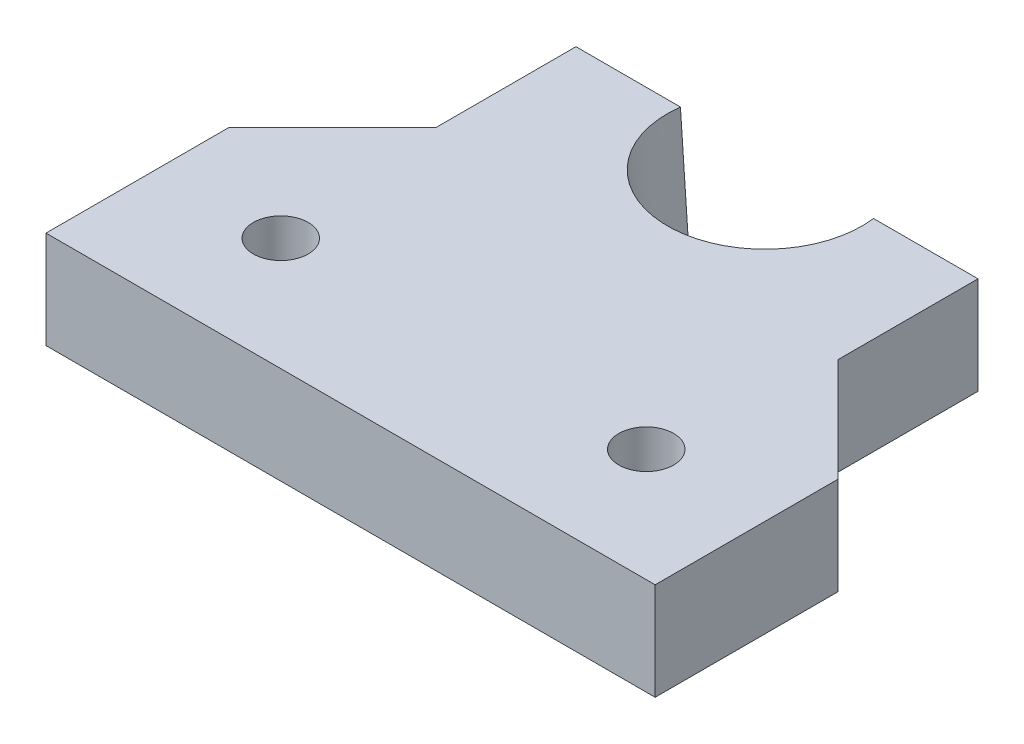
ISO-10303-21;
HEADER;
FILE_DESCRIPTION(('STEP AP214'),'2;1');
FILE_NAME('part.step','',(''),(''),'','','');
FILE_SCHEMA(('AUTOMOTIVE_DESIGN { 1 0 10303 214 1 1 1 1 }'));
ENDSEC;
DATA;
#1=APPLICATION_CONTEXT('core data for automotive mechanical design processes');
#2=APPLICATION_PROTOCOL_DEFINITION('international standard','automotive_design',2000,#1);
#3=PRODUCT_CONTEXT('',#1,'mechanical');
#4=PRODUCT('Part','Part','',(#3));
#5=PRODUCT_RELATED_PRODUCT_CATEGORY('part','',(#4));
#6=PRODUCT_DEFINITION_FORMATION('','',#4);
#7=PRODUCT_DEFINITION_CONTEXT('part definition',#1,'design');
#8=PRODUCT_DEFINITION('design','',#6,#7);
#9=PRODUCT_DEFINITION_SHAPE('','',#8);
#10=(LENGTH_UNIT() NAMED_UNIT(*) SI_UNIT(.MILLI.,.METRE.));
#11=(NAMED_UNIT(*) PLANE_ANGLE_UNIT() SI_UNIT($,.RADIAN.));
#12=(NAMED_UNIT(*) SI_UNIT($,.STERADIAN.) SOLID_ANGLE_UNIT());
#13=UNCERTAINTY_MEASURE_WITH_UNIT(LENGTH_MEASURE(1.E-05),#10,'distance_accuracy_value','');
#14=(GEOMETRIC_REPRESENTATION_CONTEXT(3) GLOBAL_UNCERTAINTY_ASSIGNED_CONTEXT((#13)) GLOBAL_UNIT_ASSIGNED_CONTEXT((#10,
#11,#12)) REPRESENTATION_CONTEXT('',''));
#15=CARTESIAN_POINT('',(0.,0.,0.));
#16=DIRECTION('',(0.,0.,1.));
#17=DIRECTION('',(1.,0.,0.));
#18=AXIS2_PLACEMENT_3D('',#15,#16,#17);
#19=CARTESIAN_POINT('',(-16.5,8.,-23.9262531440162));
#20=DIRECTION('',(0.,0.,-1.));
#21=DIRECTION('',(-1.,0.,0.));
#22=AXIS2_PLACEMENT_3D('',#19,#20,#21);
#23=PLANE('',#22);
#24=CARTESIAN_POINT('',(-6.40774899503773,-13.5076016005479,-23.9262531440162));
#25=CARTESIAN_POINT('',(-6.693067882774,-9.47607372153688,-23.9262531440162));
#26=CARTESIAN_POINT('',(-6.97795295049185,-5.44451517710205,-23.9262531440162));
#27=CARTESIAN_POINT('',(-7.30520488775533,-0.80833562008589,-23.9262531440162));
#28=CARTESIAN_POINT('',(-7.34787449308551,-0.20373597765883,-23.9262531440162));
#29=CARTESIAN_POINT('',(-7.71768587915486,5.03705098494973,-23.9262531440162));
#30=CARTESIAN_POINT('',(-8.04444926638448,9.67326500778183,-23.9262531440162));
#31=CARTESIAN_POINT('',(-8.80055169713948,20.4096601993834,-23.9262531440162));
#32=CARTESIAN_POINT('',(-9.22970042909497,26.5098547661071,-23.9262531440162));
#33=CARTESIAN_POINT('',(-10.0873841004462,38.7102870049071,-23.9262531440162));
#34=CARTESIAN_POINT('',(-10.5159190398468,44.8105246769831,-23.9262531440162));
#35=CARTESIAN_POINT('',(-10.9442907671858,50.9107737822675,-23.9262531440162));
#36=B_SPLINE_CURVE_WITH_KNOTS('',3,(#24,#25,#26,#27,#28,#29,#30,#31,#32,#33,#34,#35),
.UNSPECIFIED.,.F.,.F.,(4,2,2,2,2,4),(0.,12.1248345725337,13.9431449984623,27.8862899623064,
46.2321036588837,64.5779172095127),.UNSPECIFIED.);
#37=CARTESIAN_POINT('',(-7.22108717576516,-2.,-23.9262531440162));
#38=VERTEX_POINT('',#37);
#39=CARTESIAN_POINT('',(-7.92643709898856,8.,-23.9262531440162));
#40=VERTEX_POINT('',#39);
#41=EDGE_CURVE('E139',#38,#40,#36,.T.);
#42=ORIENTED_EDGE('',*,*,#41,.F.);
#43=DIRECTION('',(1.,0.,0.));
#44=VECTOR('',#43,1.);
#45=CARTESIAN_POINT('',(-9.99999999999999,-2.,-23.9262531440162));
#46=LINE('',#45,#44);
#47=CARTESIAN_POINT('',(-9.99999999999999,-2.,-23.9262531440162));
#48=VERTEX_POINT('',#47);
#49=EDGE_CURVE('E261',#48,#38,#46,.T.);
#50=ORIENTED_EDGE('',*,*,#49,.F.);
#51=DIRECTION('',(0.,1.,0.));
#52=VECTOR('',#51,1.);
#53=CARTESIAN_POINT('',(-9.99999999999999,-2.,-23.9262531440162));
#54=LINE('',#53,#52);
#55=CARTESIAN_POINT('',(-9.99999999999999,0.,-23.9262531440162));
#56=VERTEX_POINT('',#55);
#57=EDGE_CURVE('E167',#48,#56,#54,.T.);
#58=ORIENTED_EDGE('',*,*,#57,.T.);
#59=DIRECTION('',(1.,0.,0.));
#60=VECTOR('',#59,1.);
#61=CARTESIAN_POINT('',(-16.5,0.,-23.9262531440162));
#62=LINE('',#61,#60);
#63=CARTESIAN_POINT('',(-16.5,0.,-23.9262531440162));
#64=VERTEX_POINT('',#63);
#65=EDGE_CURVE('E185',#64,#56,#62,.T.);
#66=ORIENTED_EDGE('',*,*,#65,.F.);
#67=DIRECTION('',(0.,-1.,0.));
#68=VECTOR('',#67,1.);
#69=CARTESIAN_POINT('',(-16.5,8.,-23.9262531440162));
#70=LINE('',#69,#68);
#71=CARTESIAN_POINT('',(-16.5,8.,-23.9262531440162));
#72=VERTEX_POINT('',#71);
#73=EDGE_CURVE('E204',#72,#64,#70,.T.);
#74=ORIENTED_EDGE('',*,*,#73,.F.);
#75=DIRECTION('',(1.,0.,0.));
#76=VECTOR('',#75,1.);
#77=CARTESIAN_POINT('',(-16.5,8.,-23.9262531440162));
#78=LINE('',#77,#76);
#79=EDGE_CURVE('E160',#72,#40,#78,.T.);
#80=ORIENTED_EDGE('',*,*,#79,.T.);
#81=EDGE_LOOP('',(#42,#50,#58,#66,#74,#80));
#82=FACE_BOUND('',#81,.T.);
#83=ADVANCED_FACE('F32',(#82),#23,.T.);
#84=CARTESIAN_POINT('',(6.40774899503773,-13.5076016005479,-23.9262531440162));
#85=CARTESIAN_POINT('',(6.693067882774,-9.47607372153688,-23.9262531440162));
#86=CARTESIAN_POINT('',(6.97795295049185,-5.44451517710205,-23.9262531440162));
#87=CARTESIAN_POINT('',(7.30520488775533,-0.80833562008589,-23.9262531440162));
#88=CARTESIAN_POINT('',(7.34787449308551,-0.20373597765883,-23.9262531440162));
#89=CARTESIAN_POINT('',(7.71768587915486,5.03705098494973,-23.9262531440162));
#90=CARTESIAN_POINT('',(8.04444926638448,9.67326500778183,-23.9262531440162));
#91=CARTESIAN_POINT('',(8.80055169713948,20.4096601993834,-23.9262531440162));
#92=CARTESIAN_POINT('',(9.22970042909497,26.5098547661071,-23.9262531440162));
#93=CARTESIAN_POINT('',(10.0873841004462,38.7102870049071,-23.9262531440162));
#94=CARTESIAN_POINT('',(10.5159190398468,44.8105246769831,-23.9262531440162));
#95=CARTESIAN_POINT('',(10.9442907671858,50.9107737822675,-23.9262531440162));
#96=B_SPLINE_CURVE_WITH_KNOTS('',3,(#84,#85,#86,#87,#88,#89,#90,#91,#92,#93,#94,#95),
.UNSPECIFIED.,.F.,.F.,(4,2,2,2,2,4),(0.,12.1248345725337,13.9431449984623,27.8862899623064,
46.2321036588837,64.5779172095127),.UNSPECIFIED.);
#97=CARTESIAN_POINT('',(7.92643709898856,8.,-23.9262531440162));
#98=VERTEX_POINT('',#97);
#99=CARTESIAN_POINT('',(7.22108717576516,-2.,-23.9262531440162));
#100=VERTEX_POINT('',#99);
#101=EDGE_CURVE('E48',#98,#100,#96,.F.);
#102=ORIENTED_EDGE('',*,*,#101,.F.);
#103=CARTESIAN_POINT('',(16.5,8.,-23.9262531440162));
#104=VERTEX_POINT('',#103);
#105=EDGE_CURVE('E150',#98,#104,#78,.T.);
#106=ORIENTED_EDGE('',*,*,#105,.T.);
#107=DIRECTION('',(0.,-1.,0.));
#108=VECTOR('',#107,1.);
#109=CARTESIAN_POINT('',(16.5,8.,-23.9262531440162));
#110=LINE('',#109,#108);
#111=CARTESIAN_POINT('',(16.5,0.,-23.9262531440162));
#112=VERTEX_POINT('',#111);
#113=EDGE_CURVE('E184',#104,#112,#110,.T.);
#114=ORIENTED_EDGE('',*,*,#113,.T.);
#115=CARTESIAN_POINT('',(10.,0.,-23.9262531440162));
#116=VERTEX_POINT('',#115);
#117=EDGE_CURVE('E189',#116,#112,#62,.T.);
#118=ORIENTED_EDGE('',*,*,#117,.F.);
#119=DIRECTION('',(0.,1.,0.));
#120=VECTOR('',#119,1.);
#121=CARTESIAN_POINT('',(10.,-2.,-23.9262531440162));
#122=LINE('',#121,#120);
#123=CARTESIAN_POINT('',(10.,-2.,-23.9262531440162));
#124=VERTEX_POINT('',#123);
#125=EDGE_CURVE('E265',#124,#116,#122,.T.);
#126=ORIENTED_EDGE('',*,*,#125,.F.);
#127=EDGE_CURVE('E153',#100,#124,#46,.T.);
#128=ORIENTED_EDGE('',*,*,#127,.F.);
#129=EDGE_LOOP('',(#102,#106,#114,#118,#126,#128));
#130=FACE_BOUND('',#129,.T.);
#131=ADVANCED_FACE('F148',(#130),#23,.T.);
#132=CARTESIAN_POINT('',(-16.5,8.,-23.9262531440162));
#133=DIRECTION('',(1.,0.,0.));
#134=DIRECTION('',(0.,0.,-1.));
#135=AXIS2_PLACEMENT_3D('',#132,#133,#134);
#136=PLANE('',#135);
#137=DIRECTION('',(0.,0.,1.));
#138=VECTOR('',#137,1.);
#139=CARTESIAN_POINT('',(-16.5,0.,-23.9262531440162));
#140=LINE('',#139,#138);
#141=CARTESIAN_POINT('',(-16.5,0.,-12.4262531440162));
#142=VERTEX_POINT('',#141);
#143=EDGE_CURVE('E161',#64,#142,#140,.T.);
#144=ORIENTED_EDGE('',*,*,#143,.T.);
#145=DIRECTION('',(0.,-1.,0.));
#146=VECTOR('',#145,1.);
#147=CARTESIAN_POINT('',(-16.5,8.,-12.4262531440162));
#148=LINE('',#147,#146);
#149=CARTESIAN_POINT('',(-16.5,8.,-12.4262531440162));
#150=VERTEX_POINT('',#149);
#151=EDGE_CURVE('E207',#150,#142,#148,.T.);
#152=ORIENTED_EDGE('',*,*,#151,.F.);
#153=DIRECTION('',(0.,0.,1.));
#154=VECTOR('',#153,1.);
#155=CARTESIAN_POINT('',(-16.5,8.,-23.9262531440162));
#156=LINE('',#155,#154);
#157=EDGE_CURVE('E182',#72,#150,#156,.T.);
#158=ORIENTED_EDGE('',*,*,#157,.F.);
#159=ORIENTED_EDGE('',*,*,#73,.T.);
#160=EDGE_LOOP('',(#144,#152,#158,#159));
#161=FACE_BOUND('',#160,.T.);
#162=ADVANCED_FACE('F300',(#161),#136,.F.);
#163=CARTESIAN_POINT('',(-16.5,8.,-12.4262531440162));
#164=DIRECTION('',(0.707106781186548,0.,0.707106781186547));
#165=DIRECTION('',(0.707106781186547,0.,-0.707106781186548));
#166=AXIS2_PLACEMENT_3D('',#163,#164,#165);
#167=PLANE('',#166);
#168=DIRECTION('',(-0.707106781186547,0.,0.707106781186548));
#169=VECTOR('',#168,1.);
#170=CARTESIAN_POINT('',(-16.5,0.,-12.4262531440162));
#171=LINE('',#170,#169);
#172=CARTESIAN_POINT('',(-25.,0.,-3.92625314401615));
#173=VERTEX_POINT('',#172);
#174=EDGE_CURVE('E163',#142,#173,#171,.T.);
#175=ORIENTED_EDGE('',*,*,#174,.T.);
#176=DIRECTION('',(0.,-1.,0.));
#177=VECTOR('',#176,1.);
#178=CARTESIAN_POINT('',(-25.,8.,-3.92625314401615));
#179=LINE('',#178,#177);
#180=CARTESIAN_POINT('',(-25.,8.,-3.92625314401615));
#181=VERTEX_POINT('',#180);
#182=EDGE_CURVE('E210',#181,#173,#179,.T.);
#183=ORIENTED_EDGE('',*,*,#182,.F.);
#184=DIRECTION('',(-0.707106781186547,0.,0.707106781186548));
#185=VECTOR('',#184,1.);
#186=CARTESIAN_POINT('',(-16.5,8.,-12.4262531440162));
#187=LINE('',#186,#185);
#188=EDGE_CURVE('E180',#150,#181,#187,.T.);
#189=ORIENTED_EDGE('',*,*,#188,.F.);
#190=ORIENTED_EDGE('',*,*,#151,.T.);
#191=EDGE_LOOP('',(#175,#183,#189,#190));
#192=FACE_BOUND('',#191,.T.);
#193=ADVANCED_FACE('F295',(#192),#167,.F.);
#194=CARTESIAN_POINT('',(-25.,8.,-3.92625314401615));
#195=DIRECTION('',(1.,0.,0.));
#196=DIRECTION('',(0.,0.,-1.));
#197=AXIS2_PLACEMENT_3D('',#194,#195,#196);
#198=PLANE('',#197);
#199=DIRECTION('',(0.,0.,1.));
#200=VECTOR('',#199,1.);
#201=CARTESIAN_POINT('',(-25.,0.,-3.92625314401615));
#202=LINE('',#201,#200);
#203=CARTESIAN_POINT('',(-25.,0.,11.0737468559839));
#204=VERTEX_POINT('',#203);
#205=EDGE_CURVE('E201',#173,#204,#202,.T.);
#206=ORIENTED_EDGE('',*,*,#205,.T.);
#207=DIRECTION('',(0.,-1.,0.));
#208=VECTOR('',#207,1.);
#209=CARTESIAN_POINT('',(-25.,8.,11.0737468559839));
#210=LINE('',#209,#208);
#211=CARTESIAN_POINT('',(-25.,8.,11.0737468559839));
#212=VERTEX_POINT('',#211);
#213=EDGE_CURVE('E213',#212,#204,#210,.T.);
#214=ORIENTED_EDGE('',*,*,#213,.F.);
#215=DIRECTION('',(0.,0.,1.));
#216=VECTOR('',#215,1.);
#217=CARTESIAN_POINT('',(-25.,8.,-3.92625314401615));
#218=LINE('',#217,#216);
#219=EDGE_CURVE('E178',#181,#212,#218,.T.);
#220=ORIENTED_EDGE('',*,*,#219,.F.);
#221=ORIENTED_EDGE('',*,*,#182,.T.);
#222=EDGE_LOOP('',(#206,#214,#220,#221));
#223=FACE_BOUND('',#222,.T.);
#224=ADVANCED_FACE('F290',(#223),#198,.F.);
#225=CARTESIAN_POINT('',(-25.,8.,11.0737468559839));
#226=DIRECTION('',(0.,0.,-1.));
#227=DIRECTION('',(-1.,0.,0.));
#228=AXIS2_PLACEMENT_3D('',#225,#226,#227);
#229=PLANE('',#228);
#230=DIRECTION('',(1.,0.,0.));
#231=VECTOR('',#230,1.);
#232=CARTESIAN_POINT('',(-25.,0.,11.0737468559839));
#233=LINE('',#232,#231);
#234=CARTESIAN_POINT('',(25.,0.,11.0737468559839));
#235=VERTEX_POINT('',#234);
#236=EDGE_CURVE('E198',#204,#235,#233,.T.);
#237=ORIENTED_EDGE('',*,*,#236,.T.);
#238=DIRECTION('',(0.,-1.,0.));
#239=VECTOR('',#238,1.);
#240=CARTESIAN_POINT('',(25.,8.,11.0737468559839));
#241=LINE('',#240,#239);
#242=CARTESIAN_POINT('',(25.,8.,11.0737468559839));
#243=VERTEX_POINT('',#242);
#244=EDGE_CURVE('E216',#243,#235,#241,.T.);
#245=ORIENTED_EDGE('',*,*,#244,.F.);
#246=DIRECTION('',(1.,0.,0.));
#247=VECTOR('',#246,1.);
#248=CARTESIAN_POINT('',(-25.,8.,11.0737468559839));
#249=LINE('',#248,#247);
#250=EDGE_CURVE('E176',#212,#243,#249,.T.);
#251=ORIENTED_EDGE('',*,*,#250,.F.);
#252=ORIENTED_EDGE('',*,*,#213,.T.);
#253=EDGE_LOOP('',(#237,#245,#251,#252));
#254=FACE_BOUND('',#253,.T.);
#255=ADVANCED_FACE('F286',(#254),#229,.F.);
#256=CARTESIAN_POINT('',(25.,8.,-3.92625314401615));
#257=DIRECTION('',(1.,0.,0.));
#258=DIRECTION('',(0.,0.,-1.));
#259=AXIS2_PLACEMENT_3D('',#256,#257,#258);
#260=PLANE('',#259);
#261=DIRECTION('',(0.,0.,1.));
#262=VECTOR('',#261,1.);
#263=CARTESIAN_POINT('',(25.,0.,-3.92625314401615));
#264=LINE('',#263,#262);
#265=CARTESIAN_POINT('',(25.,0.,-3.92625314401615));
#266=VERTEX_POINT('',#265);
#267=EDGE_CURVE('E195',#266,#235,#264,.T.);
#268=ORIENTED_EDGE('',*,*,#267,.F.);
#269=DIRECTION('',(0.,-1.,0.));
#270=VECTOR('',#269,1.);
#271=CARTESIAN_POINT('',(25.,8.,-3.92625314401615));
#272=LINE('',#271,#270);
#273=CARTESIAN_POINT('',(25.,8.,-3.92625314401615));
#274=VERTEX_POINT('',#273);
#275=EDGE_CURVE('E218',#274,#266,#272,.T.);
#276=ORIENTED_EDGE('',*,*,#275,.F.);
#277=DIRECTION('',(0.,0.,1.));
#278=VECTOR('',#277,1.);
#279=CARTESIAN_POINT('',(25.,8.,-3.92625314401615));
#280=LINE('',#279,#278);
#281=EDGE_CURVE('E173',#274,#243,#280,.T.);
#282=ORIENTED_EDGE('',*,*,#281,.T.);
#283=ORIENTED_EDGE('',*,*,#244,.T.);
#284=EDGE_LOOP('',(#268,#276,#282,#283));
#285=FACE_BOUND('',#284,.T.);
#286=ADVANCED_FACE('F281',(#285),#260,.T.);
#287=CARTESIAN_POINT('',(16.5,8.,-12.4262531440162));
#288=DIRECTION('',(0.707106781186548,0.,-0.707106781186547));
#289=DIRECTION('',(-0.707106781186547,0.,-0.707106781186548));
#290=AXIS2_PLACEMENT_3D('',#287,#288,#289);
#291=PLANE('',#290);
#292=DIRECTION('',(0.707106781186547,0.,0.707106781186548));
#293=VECTOR('',#292,1.);
#294=CARTESIAN_POINT('',(16.5,0.,-12.4262531440162));
#295=LINE('',#294,#293);
#296=CARTESIAN_POINT('',(16.5,0.,-12.4262531440162));
#297=VERTEX_POINT('',#296);
#298=EDGE_CURVE('E192',#297,#266,#295,.T.);
#299=ORIENTED_EDGE('',*,*,#298,.F.);
#300=DIRECTION('',(0.,-1.,0.));
#301=VECTOR('',#300,1.);
#302=CARTESIAN_POINT('',(16.5,8.,-12.4262531440162));
#303=LINE('',#302,#301);
#304=CARTESIAN_POINT('',(16.5,8.,-12.4262531440162));
#305=VERTEX_POINT('',#304);
#306=EDGE_CURVE('E220',#305,#297,#303,.T.);
#307=ORIENTED_EDGE('',*,*,#306,.F.);
#308=DIRECTION('',(0.707106781186547,0.,0.707106781186548));
#309=VECTOR('',#308,1.);
#310=CARTESIAN_POINT('',(16.5,8.,-12.4262531440162));
#311=LINE('',#310,#309);
#312=EDGE_CURVE('E170',#305,#274,#311,.T.);
#313=ORIENTED_EDGE('',*,*,#312,.T.);
#314=ORIENTED_EDGE('',*,*,#275,.T.);
#315=EDGE_LOOP('',(#299,#307,#313,#314));
#316=FACE_BOUND('',#315,.T.);
#317=ADVANCED_FACE('F276',(#316),#291,.T.);
#318=CARTESIAN_POINT('',(16.5,8.,-23.9262531440162));
#319=DIRECTION('',(1.,0.,0.));
#320=DIRECTION('',(0.,0.,-1.));
#321=AXIS2_PLACEMENT_3D('',#318,#319,#320);
#322=PLANE('',#321);
#323=DIRECTION('',(0.,0.,1.));
#324=VECTOR('',#323,1.);
#325=CARTESIAN_POINT('',(16.5,0.,-23.9262531440162));
#326=LINE('',#325,#324);
#327=EDGE_CURVE('E188',#112,#297,#326,.T.);
#328=ORIENTED_EDGE('',*,*,#327,.F.);
#329=ORIENTED_EDGE('',*,*,#113,.F.);
#330=DIRECTION('',(0.,0.,1.));
#331=VECTOR('',#330,1.);
#332=CARTESIAN_POINT('',(16.5,8.,-23.9262531440162));
#333=LINE('',#332,#331);
#334=EDGE_CURVE('E159',#104,#305,#333,.T.);
#335=ORIENTED_EDGE('',*,*,#334,.T.);
#336=ORIENTED_EDGE('',*,*,#306,.T.);
#337=EDGE_LOOP('',(#328,#329,#335,#336));
#338=FACE_BOUND('',#337,.T.);
#339=ADVANCED_FACE('F273',(#338),#322,.T.);
#340=CARTESIAN_POINT('',(0.,8.,0.));
#341=DIRECTION('',(0.,-1.,0.));
#342=DIRECTION('',(0.,0.,-1.));
#343=AXIS2_PLACEMENT_3D('',#340,#341,#342);
#344=PLANE('',#343);
#345=CARTESIAN_POINT('',(-15.,8.,1.80400609258122));
#346=DIRECTION('',(0.,-1.,0.));
#347=DIRECTION('',(0.,0.,-1.));
#348=AXIS2_PLACEMENT_3D('',#345,#346,#347);
#349=CIRCLE('',#348,2.25);
#350=CARTESIAN_POINT('',(-15.,8.,-0.445993907418779));
#351=VERTEX_POINT('',#350);
#352=EDGE_CURVE('E501',#351,#351,#349,.T.);
#353=ORIENTED_EDGE('',*,*,#352,.T.);
#354=EDGE_LOOP('',(#353));
#355=FACE_BOUND('',#354,.T.);
#356=CARTESIAN_POINT('',(15.,8.,1.80400609258122));
#357=DIRECTION('',(0.,-1.,0.));
#358=DIRECTION('',(0.,0.,-1.));
#359=AXIS2_PLACEMENT_3D('',#356,#357,#358);
#360=CIRCLE('',#359,2.25);
#361=CARTESIAN_POINT('',(15.,8.,-0.445993907418777));
#362=VERTEX_POINT('',#361);
#363=EDGE_CURVE('E301',#362,#362,#360,.T.);
#364=ORIENTED_EDGE('',*,*,#363,.T.);
#365=EDGE_LOOP('',(#364));
#366=FACE_BOUND('',#365,.T.);
#367=ORIENTED_EDGE('',*,*,#105,.F.);
#368=CARTESIAN_POINT('',(0.,8.,-22.9262531440162));
#369=DIRECTION('',(0.,-1.,0.));
#370=DIRECTION('',(0.,0.,-1.));
#371=AXIS2_PLACEMENT_3D('',#368,#369,#370);
#372=CIRCLE('',#371,7.9892681194351);
#373=EDGE_CURVE('E136',#98,#40,#372,.T.);
#374=ORIENTED_EDGE('',*,*,#373,.T.);
#375=ORIENTED_EDGE('',*,*,#79,.F.);
#376=ORIENTED_EDGE('',*,*,#157,.T.);
#377=ORIENTED_EDGE('',*,*,#188,.T.);
#378=ORIENTED_EDGE('',*,*,#219,.T.);
#379=ORIENTED_EDGE('',*,*,#250,.T.);
#380=ORIENTED_EDGE('',*,*,#281,.F.);
#381=ORIENTED_EDGE('',*,*,#312,.F.);
#382=ORIENTED_EDGE('',*,*,#334,.F.);
#383=EDGE_LOOP('',(#367,#374,#375,#376,#377,#378,#379,#380,#381,#382));
#384=FACE_BOUND('',#383,.T.);
#385=ADVANCED_FACE('F156',(#355,#366,#384),#344,.F.);
#386=CARTESIAN_POINT('',(0.,0.,0.));
#387=DIRECTION('',(0.,-1.,0.));
#388=DIRECTION('',(0.,0.,-1.));
#389=AXIS2_PLACEMENT_3D('',#386,#387,#388);
#390=PLANE('',#389);
#391=CARTESIAN_POINT('',(-15.,0.,1.80400609258122));
#392=DIRECTION('',(0.,-1.,0.));
#393=DIRECTION('',(0.,0.,-1.));
#394=AXIS2_PLACEMENT_3D('',#391,#392,#393);
#395=CIRCLE('',#394,5.);
#396=CARTESIAN_POINT('',(-15.,0.,-3.19599390741878));
#397=VERTEX_POINT('',#396);
#398=EDGE_CURVE('E494',#397,#397,#395,.T.);
#399=ORIENTED_EDGE('',*,*,#398,.F.);
#400=EDGE_LOOP('',(#399));
#401=FACE_BOUND('',#400,.T.);
#402=CARTESIAN_POINT('',(15.,0.,1.80400609258122));
#403=DIRECTION('',(0.,-1.,0.));
#404=DIRECTION('',(0.,0.,-1.));
#405=AXIS2_PLACEMENT_3D('',#402,#403,#404);
#406=CIRCLE('',#405,5.);
#407=CARTESIAN_POINT('',(15.,0.,-3.19599390741878));
#408=VERTEX_POINT('',#407);
#409=EDGE_CURVE('E504',#408,#408,#406,.T.);
#410=ORIENTED_EDGE('',*,*,#409,.F.);
#411=EDGE_LOOP('',(#410));
#412=FACE_BOUND('',#411,.T.);
#413=DIRECTION('',(0.,0.,1.));
#414=VECTOR('',#413,1.);
#415=CARTESIAN_POINT('',(10.,0.,-3.92625314401615));
#416=LINE('',#415,#414);
#417=CARTESIAN_POINT('',(10.,0.,-13.9262531440162));
#418=VERTEX_POINT('',#417);
#419=EDGE_CURVE('E239',#116,#418,#416,.T.);
#420=ORIENTED_EDGE('',*,*,#419,.F.);
#421=ORIENTED_EDGE('',*,*,#117,.T.);
#422=ORIENTED_EDGE('',*,*,#327,.T.);
#423=ORIENTED_EDGE('',*,*,#298,.T.);
#424=ORIENTED_EDGE('',*,*,#267,.T.);
#425=ORIENTED_EDGE('',*,*,#236,.F.);
#426=ORIENTED_EDGE('',*,*,#205,.F.);
#427=ORIENTED_EDGE('',*,*,#174,.F.);
#428=ORIENTED_EDGE('',*,*,#143,.F.);
#429=ORIENTED_EDGE('',*,*,#65,.T.);
#430=DIRECTION('',(0.,0.,-1.));
#431=VECTOR('',#430,1.);
#432=CARTESIAN_POINT('',(-10.,0.,-3.92625314401615));
#433=LINE('',#432,#431);
#434=CARTESIAN_POINT('',(-9.99999999999999,0.,-13.9262531440162));
#435=VERTEX_POINT('',#434);
#436=EDGE_CURVE('E246',#435,#56,#433,.T.);
#437=ORIENTED_EDGE('',*,*,#436,.F.);
#438=CARTESIAN_POINT('',(0.,0.,-13.9262531440162));
#439=DIRECTION('',(0.,-1.,0.));
#440=DIRECTION('',(0.,0.,-1.));
#441=AXIS2_PLACEMENT_3D('',#438,#439,#440);
#442=CIRCLE('',#441,10.);
#443=CARTESIAN_POINT('',(0.,0.,-3.92625314401615));
#444=VERTEX_POINT('',#443);
#445=EDGE_CURVE('E41',#435,#444,#442,.F.);
#446=ORIENTED_EDGE('',*,*,#445,.T.);
#447=CARTESIAN_POINT('',(0.,0.,-13.9262531440162));
#448=DIRECTION('',(0.,-1.,0.));
#449=DIRECTION('',(0.,0.,-1.));
#450=AXIS2_PLACEMENT_3D('',#447,#448,#449);
#451=CIRCLE('',#450,10.);
#452=EDGE_CURVE('E11',#444,#418,#451,.F.);
#453=ORIENTED_EDGE('',*,*,#452,.T.);
#454=EDGE_LOOP('',(#420,#421,#422,#423,#424,#425,#426,#427,#428,#429,#437,#446,#453));
#455=FACE_BOUND('',#454,.T.);
#456=ADVANCED_FACE('F270',(#401,#412,#455),#390,.T.);
#457=CARTESIAN_POINT('',(10.,-2.,-3.92625314401615));
#458=DIRECTION('',(-1.,0.,0.));
#459=DIRECTION('',(0.,0.,1.));
#460=AXIS2_PLACEMENT_3D('',#457,#458,#459);
#461=PLANE('',#460);
#462=ORIENTED_EDGE('',*,*,#419,.T.);
#463=DIRECTION('',(0.,1.,0.));
#464=VECTOR('',#463,1.);
#465=CARTESIAN_POINT('',(10.,-2.,-13.9262531440162));
#466=LINE('',#465,#464);
#467=CARTESIAN_POINT('',(10.,-2.,-13.9262531440162));
#468=VERTEX_POINT('',#467);
#469=EDGE_CURVE('E229',#418,#468,#466,.F.);
#470=ORIENTED_EDGE('',*,*,#469,.T.);
#471=DIRECTION('',(0.,0.,1.));
#472=VECTOR('',#471,1.);
#473=CARTESIAN_POINT('',(10.,-2.,-3.92625314401615));
#474=LINE('',#473,#472);
#475=EDGE_CURVE('E238',#124,#468,#474,.T.);
#476=ORIENTED_EDGE('',*,*,#475,.F.);
#477=ORIENTED_EDGE('',*,*,#125,.T.);
#478=EDGE_LOOP('',(#462,#470,#476,#477));
#479=FACE_BOUND('',#478,.T.);
#480=ADVANCED_FACE('F236',(#479),#461,.F.);
#481=CARTESIAN_POINT('',(-10.,-2.,-3.92625314401615));
#482=DIRECTION('',(1.,0.,0.));
#483=DIRECTION('',(0.,0.,-1.));
#484=AXIS2_PLACEMENT_3D('',#481,#482,#483);
#485=PLANE('',#484);
#486=DIRECTION('',(0.,0.,-1.));
#487=VECTOR('',#486,1.);
#488=CARTESIAN_POINT('',(-10.,-2.,-3.92625314401615));
#489=LINE('',#488,#487);
#490=CARTESIAN_POINT('',(-9.99999999999999,-2.,-13.9262531440162));
#491=VERTEX_POINT('',#490);
#492=EDGE_CURVE('E245',#491,#48,#489,.T.);
#493=ORIENTED_EDGE('',*,*,#492,.F.);
#494=DIRECTION('',(0.,1.,0.));
#495=VECTOR('',#494,1.);
#496=CARTESIAN_POINT('',(-9.99999999999999,-2.,-13.9262531440162));
#497=LINE('',#496,#495);
#498=EDGE_CURVE('E206',#491,#435,#497,.T.);
#499=ORIENTED_EDGE('',*,*,#498,.T.);
#500=ORIENTED_EDGE('',*,*,#436,.T.);
#501=ORIENTED_EDGE('',*,*,#57,.F.);
#502=EDGE_LOOP('',(#493,#499,#500,#501));
#503=FACE_BOUND('',#502,.T.);
#504=ADVANCED_FACE('F257',(#503),#485,.F.);
#505=CARTESIAN_POINT('',(0.,-2.,0.));
#506=DIRECTION('',(0.,-1.,0.));
#507=DIRECTION('',(0.,0.,-1.));
#508=AXIS2_PLACEMENT_3D('',#505,#506,#507);
#509=PLANE('',#508);
#510=CARTESIAN_POINT('',(0.,-2.,-22.9262531440162));
#511=DIRECTION('',(0.,-1.,0.));
#512=DIRECTION('',(0.,0.,-1.));
#513=AXIS2_PLACEMENT_3D('',#510,#511,#512);
#514=CIRCLE('',#513,7.29);
#515=EDGE_CURVE('E144',#100,#38,#514,.T.);
#516=ORIENTED_EDGE('',*,*,#515,.F.);
#517=ORIENTED_EDGE('',*,*,#127,.T.);
#518=ORIENTED_EDGE('',*,*,#475,.T.);
#519=CARTESIAN_POINT('',(0.,-2.,-13.9262531440162));
#520=DIRECTION('',(0.,-1.,0.));
#521=DIRECTION('',(0.,0.,-1.));
#522=AXIS2_PLACEMENT_3D('',#519,#520,#521);
#523=CIRCLE('',#522,10.);
#524=CARTESIAN_POINT('',(0.,-2.,-3.92625314401615));
#525=VERTEX_POINT('',#524);
#526=EDGE_CURVE('E225',#468,#525,#523,.T.);
#527=ORIENTED_EDGE('',*,*,#526,.T.);
#528=CARTESIAN_POINT('',(0.,-2.,-13.9262531440162));
#529=DIRECTION('',(0.,-1.,0.));
#530=DIRECTION('',(0.,0.,-1.));
#531=AXIS2_PLACEMENT_3D('',#528,#529,#530);
#532=CIRCLE('',#531,10.);
#533=EDGE_CURVE('E227',#525,#491,#532,.T.);
#534=ORIENTED_EDGE('',*,*,#533,.T.);
#535=ORIENTED_EDGE('',*,*,#492,.T.);
#536=ORIENTED_EDGE('',*,*,#49,.T.);
#537=EDGE_LOOP('',(#516,#517,#518,#527,#534,#535,#536));
#538=FACE_BOUND('',#537,.T.);
#539=ADVANCED_FACE('F243',(#538),#509,.T.);
#540=CARTESIAN_POINT('',(0.,-2.,-13.9262531440162));
#541=DIRECTION('',(0.,1.,0.));
#542=DIRECTION('',(0.,0.,1.));
#543=AXIS2_PLACEMENT_3D('',#540,#541,#542);
#544=CYLINDRICAL_SURFACE('',#543,10.);
#545=DIRECTION('',(0.,1.,0.));
#546=VECTOR('',#545,1.);
#547=CARTESIAN_POINT('',(0.,-2.,-3.92625314401615));
#548=LINE('',#547,#546);
#549=EDGE_CURVE('E36',#525,#444,#548,.T.);
#550=ORIENTED_EDGE('',*,*,#549,.F.);
#551=ORIENTED_EDGE('',*,*,#526,.F.);
#552=ORIENTED_EDGE('',*,*,#469,.F.);
#553=ORIENTED_EDGE('',*,*,#452,.F.);
#554=EDGE_LOOP('',(#550,#551,#552,#553));
#555=FACE_BOUND('',#554,.T.);
#556=ADVANCED_FACE('F34',(#555),#544,.T.);
#557=CARTESIAN_POINT('',(0.,-2.,-13.9262531440162));
#558=DIRECTION('',(0.,1.,0.));
#559=DIRECTION('',(0.,0.,1.));
#560=AXIS2_PLACEMENT_3D('',#557,#558,#559);
#561=CYLINDRICAL_SURFACE('',#560,10.);
#562=ORIENTED_EDGE('',*,*,#533,.F.);
#563=ORIENTED_EDGE('',*,*,#549,.T.);
#564=ORIENTED_EDGE('',*,*,#445,.F.);
#565=ORIENTED_EDGE('',*,*,#498,.F.);
#566=EDGE_LOOP('',(#562,#563,#564,#565));
#567=FACE_BOUND('',#566,.T.);
#568=ADVANCED_FACE('F252',(#567),#561,.T.);
#569=CARTESIAN_POINT('',(0.,-2.,-22.9262531440162));
#570=DIRECTION('',(0.,1.,0.));
#571=DIRECTION('',(0.,0.,-1.));
#572=AXIS2_PLACEMENT_3D('',#569,#570,#571);
#573=CONICAL_SURFACE('',#572,7.29,0.0698131700797732);
#574=ORIENTED_EDGE('',*,*,#41,.T.);
#575=ORIENTED_EDGE('',*,*,#373,.F.);
#576=ORIENTED_EDGE('',*,*,#101,.T.);
#577=ORIENTED_EDGE('',*,*,#515,.T.);
#578=EDGE_LOOP('',(#574,#575,#576,#577));
#579=FACE_BOUND('',#578,.T.);
#580=ADVANCED_FACE('F137',(#579),#573,.F.);
#581=CARTESIAN_POINT('',(15.,0.,1.80400609258122));
#582=DIRECTION('',(0.,-1.,0.));
#583=DIRECTION('',(0.,0.,-1.));
#584=AXIS2_PLACEMENT_3D('',#581,#582,#583);
#585=CYLINDRICAL_SURFACE('',#584,2.25);
#586=ORIENTED_EDGE('',*,*,#363,.F.);
#587=EDGE_LOOP('',(#586));
#588=FACE_BOUND('',#587,.T.);
#589=CARTESIAN_POINT('',(15.,3.,1.80400609258122));
#590=DIRECTION('',(0.,-1.,0.));
#591=DIRECTION('',(0.,0.,-1.));
#592=AXIS2_PLACEMENT_3D('',#589,#590,#591);
#593=CIRCLE('',#592,2.25);
#594=CARTESIAN_POINT('',(15.,3.,-0.445993907418777));
#595=VERTEX_POINT('',#594);
#596=EDGE_CURVE('E304',#595,#595,#593,.T.);
#597=ORIENTED_EDGE('',*,*,#596,.T.);
#598=EDGE_LOOP('',(#597));
#599=FACE_BOUND('',#598,.T.);
#600=ADVANCED_FACE('F328',(#588,#599),#585,.F.);
#601=CARTESIAN_POINT('',(17.25,3.,1.80400609258122));
#602=DIRECTION('',(0.,1.,0.));
#603=DIRECTION('',(0.,0.,1.));
#604=AXIS2_PLACEMENT_3D('',#601,#602,#603);
#605=PLANE('',#604);
#606=ORIENTED_EDGE('',*,*,#596,.F.);
#607=EDGE_LOOP('',(#606));
#608=FACE_BOUND('',#607,.T.);
#609=CARTESIAN_POINT('',(15.,3.,1.80400609258122));
#610=DIRECTION('',(0.,-1.,0.));
#611=DIRECTION('',(0.,0.,-1.));
#612=AXIS2_PLACEMENT_3D('',#609,#610,#611);
#613=CIRCLE('',#612,5.);
#614=CARTESIAN_POINT('',(15.,3.,-3.19599390741878));
#615=VERTEX_POINT('',#614);
#616=EDGE_CURVE('E507',#615,#615,#613,.T.);
#617=ORIENTED_EDGE('',*,*,#616,.T.);
#618=EDGE_LOOP('',(#617));
#619=FACE_BOUND('',#618,.T.);
#620=ADVANCED_FACE('F435',(#608,#619),#605,.F.);
#621=CARTESIAN_POINT('',(15.,0.,1.80400609258122));
#622=DIRECTION('',(0.,-1.,0.));
#623=DIRECTION('',(0.,0.,-1.));
#624=AXIS2_PLACEMENT_3D('',#621,#622,#623);
#625=CYLINDRICAL_SURFACE('',#624,5.);
#626=ORIENTED_EDGE('',*,*,#616,.F.);
#627=EDGE_LOOP('',(#626));
#628=FACE_BOUND('',#627,.T.);
#629=ORIENTED_EDGE('',*,*,#409,.T.);
#630=EDGE_LOOP('',(#629));
#631=FACE_BOUND('',#630,.T.);
#632=ADVANCED_FACE('F443',(#628,#631),#625,.F.);
#633=CARTESIAN_POINT('',(-15.,0.,1.80400609258122));
#634=DIRECTION('',(0.,-1.,0.));
#635=DIRECTION('',(0.,0.,-1.));
#636=AXIS2_PLACEMENT_3D('',#633,#634,#635);
#637=CYLINDRICAL_SURFACE('',#636,2.25);
#638=ORIENTED_EDGE('',*,*,#352,.F.);
#639=EDGE_LOOP('',(#638));
#640=FACE_BOUND('',#639,.T.);
#641=CARTESIAN_POINT('',(-15.,3.,1.80400609258122));
#642=DIRECTION('',(0.,-1.,0.));
#643=DIRECTION('',(0.,0.,-1.));
#644=AXIS2_PLACEMENT_3D('',#641,#642,#643);
#645=CIRCLE('',#644,2.25);
#646=CARTESIAN_POINT('',(-15.,3.,-0.44599390741878));
#647=VERTEX_POINT('',#646);
#648=EDGE_CURVE('E496',#647,#647,#645,.T.);
#649=ORIENTED_EDGE('',*,*,#648,.T.);
#650=EDGE_LOOP('',(#649));
#651=FACE_BOUND('',#650,.T.);
#652=ADVANCED_FACE('F452',(#640,#651),#637,.F.);
#653=CARTESIAN_POINT('',(-12.75,3.,1.80400609258122));
#654=DIRECTION('',(0.,1.,0.));
#655=DIRECTION('',(0.,0.,1.));
#656=AXIS2_PLACEMENT_3D('',#653,#654,#655);
#657=PLANE('',#656);
#658=ORIENTED_EDGE('',*,*,#648,.F.);
#659=EDGE_LOOP('',(#658));
#660=FACE_BOUND('',#659,.T.);
#661=CARTESIAN_POINT('',(-15.,3.,1.80400609258122));
#662=DIRECTION('',(0.,-1.,0.));
#663=DIRECTION('',(0.,0.,-1.));
#664=AXIS2_PLACEMENT_3D('',#661,#662,#663);
#665=CIRCLE('',#664,5.);
#666=CARTESIAN_POINT('',(-15.,3.,-3.19599390741878));
#667=VERTEX_POINT('',#666);
#668=EDGE_CURVE('E491',#667,#667,#665,.T.);
#669=ORIENTED_EDGE('',*,*,#668,.T.);
#670=EDGE_LOOP('',(#669));
#671=FACE_BOUND('',#670,.T.);
#672=ADVANCED_FACE('F461',(#660,#671),#657,.F.);
#673=CARTESIAN_POINT('',(-15.,0.,1.80400609258122));
#674=DIRECTION('',(0.,-1.,0.));
#675=DIRECTION('',(0.,0.,-1.));
#676=AXIS2_PLACEMENT_3D('',#673,#674,#675);
#677=CYLINDRICAL_SURFACE('',#676,5.);
#678=ORIENTED_EDGE('',*,*,#668,.F.);
#679=EDGE_LOOP('',(#678));
#680=FACE_BOUND('',#679,.T.);
#681=ORIENTED_EDGE('',*,*,#398,.T.);
#682=EDGE_LOOP('',(#681));
#683=FACE_BOUND('',#682,.T.);
#684=ADVANCED_FACE('F470',(#680,#683),#677,.F.);
#685=CLOSED_SHELL('',(#83,#131,#162,#193,#224,#255,#286,#317,#339,#385,#456,#480,#504,#539,#556,
#568,#580,#600,#620,#632,#652,#672,#684));
#686=MANIFOLD_SOLID_BREP('B2',#685);
#687=ADVANCED_BREP_SHAPE_REPRESENTATION('',(#18,#686),#14);
#688=SHAPE_DEFINITION_REPRESENTATION(#9,#687);
ENDSEC;
END-ISO-10303-21;
